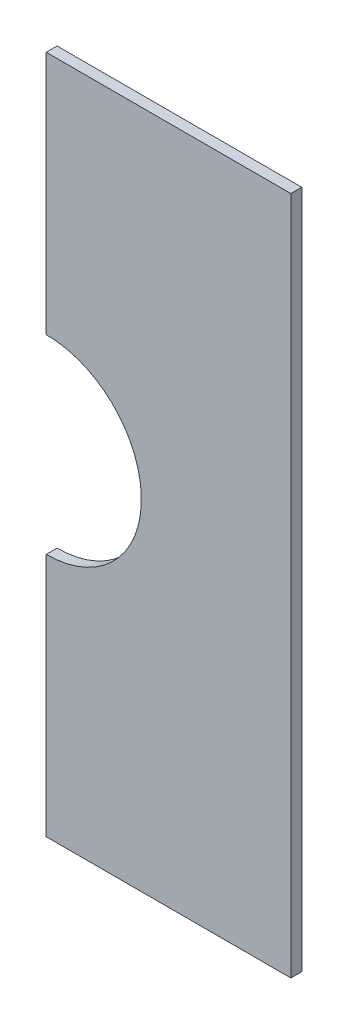
ISO-10303-21;
HEADER;
FILE_DESCRIPTION(('STEP AP214'),'2;1');
FILE_NAME('part.step','',(''),(''),'','','');
FILE_SCHEMA(('AUTOMOTIVE_DESIGN { 1 0 10303 214 1 1 1 1 }'));
ENDSEC;
DATA;
#1=APPLICATION_CONTEXT('core data for automotive mechanical design processes');
#2=APPLICATION_PROTOCOL_DEFINITION('international standard','automotive_design',2000,#1);
#3=PRODUCT_CONTEXT('',#1,'mechanical');
#4=PRODUCT('Part','Part','',(#3));
#5=PRODUCT_RELATED_PRODUCT_CATEGORY('part','',(#4));
#6=PRODUCT_DEFINITION_FORMATION('','',#4);
#7=PRODUCT_DEFINITION_CONTEXT('part definition',#1,'design');
#8=PRODUCT_DEFINITION('design','',#6,#7);
#9=PRODUCT_DEFINITION_SHAPE('','',#8);
#10=(LENGTH_UNIT() NAMED_UNIT(*) SI_UNIT(.MILLI.,.METRE.));
#11=(NAMED_UNIT(*) PLANE_ANGLE_UNIT() SI_UNIT($,.RADIAN.));
#12=(NAMED_UNIT(*) SI_UNIT($,.STERADIAN.) SOLID_ANGLE_UNIT());
#13=UNCERTAINTY_MEASURE_WITH_UNIT(LENGTH_MEASURE(1.E-05),#10,'distance_accuracy_value','');
#14=(GEOMETRIC_REPRESENTATION_CONTEXT(3) GLOBAL_UNCERTAINTY_ASSIGNED_CONTEXT((#13)) GLOBAL_UNIT_ASSIGNED_CONTEXT((#10,
#11,#12)) REPRESENTATION_CONTEXT('',''));
#15=CARTESIAN_POINT('',(0.,0.,0.));
#16=DIRECTION('',(0.,0.,1.));
#17=DIRECTION('',(1.,0.,0.));
#18=AXIS2_PLACEMENT_3D('',#15,#16,#17);
#19=CARTESIAN_POINT('',(-0.55,0.000222930594089878,0.02));
#20=DIRECTION('',(1.,0.,0.));
#21=DIRECTION('',(0.,1.,0.));
#22=AXIS2_PLACEMENT_3D('',#19,#20,#21);
#23=PLANE('',#22);
#24=DIRECTION('',(0.,-1.,0.));
#25=VECTOR('',#24,1.);
#26=CARTESIAN_POINT('',(-0.55,0.000222930594089878,0.));
#27=LINE('',#26,#25);
#28=CARTESIAN_POINT('',(-0.55,0.625,0.));
#29=VERTEX_POINT('',#28);
#30=CARTESIAN_POINT('',(-0.55,-0.62455413881182,0.));
#31=VERTEX_POINT('',#30);
#32=EDGE_CURVE('E42',#29,#31,#27,.T.);
#33=ORIENTED_EDGE('',*,*,#32,.F.);
#34=DIRECTION('',(0.,0.,-1.));
#35=VECTOR('',#34,1.);
#36=CARTESIAN_POINT('',(-0.55,0.625,0.02));
#37=LINE('',#36,#35);
#38=CARTESIAN_POINT('',(-0.55,0.625,0.02));
#39=VERTEX_POINT('',#38);
#40=EDGE_CURVE('E83',#39,#29,#37,.T.);
#41=ORIENTED_EDGE('',*,*,#40,.F.);
#42=DIRECTION('',(0.,-1.,0.));
#43=VECTOR('',#42,1.);
#44=CARTESIAN_POINT('',(-0.55,0.000222930594089878,0.02));
#45=LINE('',#44,#43);
#46=CARTESIAN_POINT('',(-0.55,-0.62455413881182,0.02));
#47=VERTEX_POINT('',#46);
#48=EDGE_CURVE('E11',#39,#47,#45,.T.);
#49=ORIENTED_EDGE('',*,*,#48,.T.);
#50=DIRECTION('',(0.,0.,-1.));
#51=VECTOR('',#50,1.);
#52=CARTESIAN_POINT('',(-0.55,-0.62455413881182,0.02));
#53=LINE('',#52,#51);
#54=EDGE_CURVE('E28',#47,#31,#53,.T.);
#55=ORIENTED_EDGE('',*,*,#54,.T.);
#56=EDGE_LOOP('',(#33,#41,#49,#55));
#57=FACE_BOUND('',#56,.T.);
#58=ADVANCED_FACE('F17',(#57),#23,.T.);
#59=CARTESIAN_POINT('',(-0.775,0.625,0.02));
#60=DIRECTION('',(0.,1.,0.));
#61=DIRECTION('',(1.,0.,0.));
#62=AXIS2_PLACEMENT_3D('',#59,#60,#61);
#63=PLANE('',#62);
#64=DIRECTION('',(1.,0.,0.));
#65=VECTOR('',#64,1.);
#66=CARTESIAN_POINT('',(-0.775,0.625,0.));
#67=LINE('',#66,#65);
#68=CARTESIAN_POINT('',(-1.,0.625,0.));
#69=VERTEX_POINT('',#68);
#70=EDGE_CURVE('E114',#69,#29,#67,.T.);
#71=ORIENTED_EDGE('',*,*,#70,.F.);
#72=DIRECTION('',(0.,0.,-1.));
#73=VECTOR('',#72,1.);
#74=CARTESIAN_POINT('',(-1.,0.625,0.02));
#75=LINE('',#74,#73);
#76=CARTESIAN_POINT('',(-1.,0.625,0.02));
#77=VERTEX_POINT('',#76);
#78=EDGE_CURVE('E111',#77,#69,#75,.T.);
#79=ORIENTED_EDGE('',*,*,#78,.F.);
#80=DIRECTION('',(1.,0.,0.));
#81=VECTOR('',#80,1.);
#82=CARTESIAN_POINT('',(-0.775,0.625,0.02));
#83=LINE('',#82,#81);
#84=EDGE_CURVE('E80',#77,#39,#83,.T.);
#85=ORIENTED_EDGE('',*,*,#84,.T.);
#86=ORIENTED_EDGE('',*,*,#40,.T.);
#87=EDGE_LOOP('',(#71,#79,#85,#86));
#88=FACE_BOUND('',#87,.T.);
#89=ADVANCED_FACE('F199',(#88),#63,.T.);
#90=CARTESIAN_POINT('',(-1.,0.400111465297045,0.02));
#91=DIRECTION('',(1.,0.,0.));
#92=DIRECTION('',(0.,1.,0.));
#93=AXIS2_PLACEMENT_3D('',#90,#91,#92);
#94=PLANE('',#93);
#95=DIRECTION('',(0.,-1.,0.));
#96=VECTOR('',#95,1.);
#97=CARTESIAN_POINT('',(-1.,0.400111465297045,0.));
#98=LINE('',#97,#96);
#99=CARTESIAN_POINT('',(-1.,0.175222930594089,0.));
#100=VERTEX_POINT('',#99);
#101=EDGE_CURVE('E21',#69,#100,#98,.T.);
#102=ORIENTED_EDGE('',*,*,#101,.T.);
#103=DIRECTION('',(0.,0.,-1.));
#104=VECTOR('',#103,1.);
#105=CARTESIAN_POINT('',(-1.,0.175222930594089,0.02));
#106=LINE('',#105,#104);
#107=CARTESIAN_POINT('',(-1.,0.175222930594089,0.02));
#108=VERTEX_POINT('',#107);
#109=EDGE_CURVE('E112',#108,#100,#106,.T.);
#110=ORIENTED_EDGE('',*,*,#109,.F.);
#111=DIRECTION('',(0.,-1.,0.));
#112=VECTOR('',#111,1.);
#113=CARTESIAN_POINT('',(-1.,0.400111465297045,0.02));
#114=LINE('',#113,#112);
#115=EDGE_CURVE('E98',#77,#108,#114,.T.);
#116=ORIENTED_EDGE('',*,*,#115,.F.);
#117=ORIENTED_EDGE('',*,*,#78,.T.);
#118=EDGE_LOOP('',(#102,#110,#116,#117));
#119=FACE_BOUND('',#118,.T.);
#120=ADVANCED_FACE('F153',(#119),#94,.F.);
#121=CARTESIAN_POINT('',(-1.,0.000222930594089715,0.02));
#122=DIRECTION('',(0.,0.,-1.));
#123=DIRECTION('',(1.,0.,0.));
#124=AXIS2_PLACEMENT_3D('',#121,#122,#123);
#125=CYLINDRICAL_SURFACE('',#124,0.175);
#126=CARTESIAN_POINT('',(-1.,0.000222930594089715,0.));
#127=DIRECTION('',(0.,0.,1.));
#128=DIRECTION('',(1.,0.,0.));
#129=AXIS2_PLACEMENT_3D('',#126,#127,#128);
#130=CIRCLE('',#129,0.175);
#131=CARTESIAN_POINT('',(-1.,-0.174777069405911,0.));
#132=VERTEX_POINT('',#131);
#133=EDGE_CURVE('E100',#132,#100,#130,.T.);
#134=ORIENTED_EDGE('',*,*,#133,.F.);
#135=DIRECTION('',(0.,0.,-1.));
#136=VECTOR('',#135,1.);
#137=CARTESIAN_POINT('',(-1.,-0.174777069405911,0.02));
#138=LINE('',#137,#136);
#139=CARTESIAN_POINT('',(-1.,-0.174777069405911,0.02));
#140=VERTEX_POINT('',#139);
#141=EDGE_CURVE('E117',#140,#132,#138,.T.);
#142=ORIENTED_EDGE('',*,*,#141,.F.);
#143=CARTESIAN_POINT('',(-1.,0.000222930594089715,0.02));
#144=DIRECTION('',(0.,0.,1.));
#145=DIRECTION('',(1.,0.,0.));
#146=AXIS2_PLACEMENT_3D('',#143,#144,#145);
#147=CIRCLE('',#146,0.175);
#148=EDGE_CURVE('E108',#140,#108,#147,.T.);
#149=ORIENTED_EDGE('',*,*,#148,.T.);
#150=ORIENTED_EDGE('',*,*,#109,.T.);
#151=EDGE_LOOP('',(#134,#142,#149,#150));
#152=FACE_BOUND('',#151,.T.);
#153=ADVANCED_FACE('F145',(#152),#125,.F.);
#154=CARTESIAN_POINT('',(-1.,-0.399665604108865,0.02));
#155=DIRECTION('',(1.,0.,0.));
#156=DIRECTION('',(0.,1.,0.));
#157=AXIS2_PLACEMENT_3D('',#154,#155,#156);
#158=PLANE('',#157);
#159=DIRECTION('',(0.,-1.,0.));
#160=VECTOR('',#159,1.);
#161=CARTESIAN_POINT('',(-1.,-0.399665604108865,0.));
#162=LINE('',#161,#160);
#163=CARTESIAN_POINT('',(-1.,-0.624554138811821,0.));
#164=VERTEX_POINT('',#163);
#165=EDGE_CURVE('E120',#132,#164,#162,.T.);
#166=ORIENTED_EDGE('',*,*,#165,.T.);
#167=DIRECTION('',(0.,0.,-1.));
#168=VECTOR('',#167,1.);
#169=CARTESIAN_POINT('',(-1.,-0.624554138811821,0.02));
#170=LINE('',#169,#168);
#171=CARTESIAN_POINT('',(-1.,-0.624554138811821,0.02));
#172=VERTEX_POINT('',#171);
#173=EDGE_CURVE('E107',#172,#164,#170,.T.);
#174=ORIENTED_EDGE('',*,*,#173,.F.);
#175=DIRECTION('',(0.,-1.,0.));
#176=VECTOR('',#175,1.);
#177=CARTESIAN_POINT('',(-1.,-0.399665604108865,0.02));
#178=LINE('',#177,#176);
#179=EDGE_CURVE('E89',#140,#172,#178,.T.);
#180=ORIENTED_EDGE('',*,*,#179,.F.);
#181=ORIENTED_EDGE('',*,*,#141,.T.);
#182=EDGE_LOOP('',(#166,#174,#180,#181));
#183=FACE_BOUND('',#182,.T.);
#184=ADVANCED_FACE('F219',(#183),#158,.F.);
#185=CARTESIAN_POINT('',(-0.775,-0.62455413881182,0.02));
#186=DIRECTION('',(0.,1.,0.));
#187=DIRECTION('',(1.,0.,0.));
#188=AXIS2_PLACEMENT_3D('',#185,#186,#187);
#189=PLANE('',#188);
#190=DIRECTION('',(1.,0.,0.));
#191=VECTOR('',#190,1.);
#192=CARTESIAN_POINT('',(-0.775,-0.62455413881182,0.));
#193=LINE('',#192,#191);
#194=EDGE_CURVE('E78',#164,#31,#193,.T.);
#195=ORIENTED_EDGE('',*,*,#194,.T.);
#196=ORIENTED_EDGE('',*,*,#54,.F.);
#197=DIRECTION('',(1.,0.,0.));
#198=VECTOR('',#197,1.);
#199=CARTESIAN_POINT('',(-0.775,-0.62455413881182,0.02));
#200=LINE('',#199,#198);
#201=EDGE_CURVE('E76',#172,#47,#200,.T.);
#202=ORIENTED_EDGE('',*,*,#201,.F.);
#203=ORIENTED_EDGE('',*,*,#173,.T.);
#204=EDGE_LOOP('',(#195,#196,#202,#203));
#205=FACE_BOUND('',#204,.T.);
#206=ADVANCED_FACE('F74',(#205),#189,.F.);
#207=CARTESIAN_POINT('',(0.,0.000222930594089878,0.02));
#208=DIRECTION('',(0.,0.,1.));
#209=DIRECTION('',(1.,0.,0.));
#210=AXIS2_PLACEMENT_3D('',#207,#208,#209);
#211=PLANE('',#210);
#212=ORIENTED_EDGE('',*,*,#48,.F.);
#213=ORIENTED_EDGE('',*,*,#84,.F.);
#214=ORIENTED_EDGE('',*,*,#115,.T.);
#215=ORIENTED_EDGE('',*,*,#148,.F.);
#216=ORIENTED_EDGE('',*,*,#179,.T.);
#217=ORIENTED_EDGE('',*,*,#201,.T.);
#218=EDGE_LOOP('',(#212,#213,#214,#215,#216,#217));
#219=FACE_BOUND('',#218,.T.);
#220=ADVANCED_FACE('F19',(#219),#211,.T.);
#221=CARTESIAN_POINT('',(0.,0.000222930594089878,0.));
#222=DIRECTION('',(0.,0.,1.));
#223=DIRECTION('',(1.,0.,0.));
#224=AXIS2_PLACEMENT_3D('',#221,#222,#223);
#225=PLANE('',#224);
#226=ORIENTED_EDGE('',*,*,#32,.T.);
#227=ORIENTED_EDGE('',*,*,#194,.F.);
#228=ORIENTED_EDGE('',*,*,#165,.F.);
#229=ORIENTED_EDGE('',*,*,#133,.T.);
#230=ORIENTED_EDGE('',*,*,#101,.F.);
#231=ORIENTED_EDGE('',*,*,#70,.T.);
#232=EDGE_LOOP('',(#226,#227,#228,#229,#230,#231));
#233=FACE_BOUND('',#232,.T.);
#234=ADVANCED_FACE('F157',(#233),#225,.F.);
#235=CLOSED_SHELL('',(#58,#89,#120,#153,#184,#206,#220,#234));
#236=MANIFOLD_SOLID_BREP('B1',#235);
#237=ADVANCED_BREP_SHAPE_REPRESENTATION('',(#18,#236),#14);
#238=SHAPE_DEFINITION_REPRESENTATION(#9,#237);
ENDSEC;
END-ISO-10303-21;
